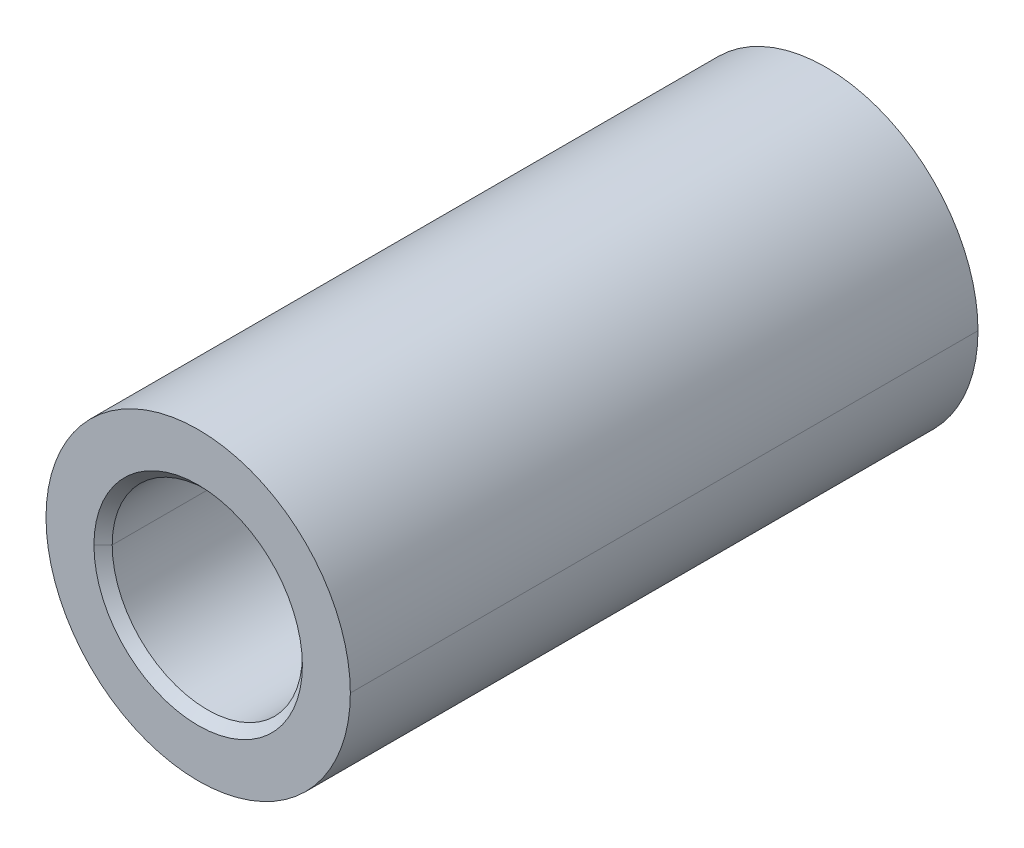
ISO-10303-21;
HEADER;
FILE_DESCRIPTION(('STEP AP214'),'2;1');
FILE_NAME('part.step','',(''),(''),'','','');
FILE_SCHEMA(('AUTOMOTIVE_DESIGN { 1 0 10303 214 1 1 1 1 }'));
ENDSEC;
DATA;
#1=APPLICATION_CONTEXT('core data for automotive mechanical design processes');
#2=APPLICATION_PROTOCOL_DEFINITION('international standard','automotive_design',2000,#1);
#3=PRODUCT_CONTEXT('',#1,'mechanical');
#4=PRODUCT('Part','Part','',(#3));
#5=PRODUCT_RELATED_PRODUCT_CATEGORY('part','',(#4));
#6=PRODUCT_DEFINITION_FORMATION('','',#4);
#7=PRODUCT_DEFINITION_CONTEXT('part definition',#1,'design');
#8=PRODUCT_DEFINITION('design','',#6,#7);
#9=PRODUCT_DEFINITION_SHAPE('','',#8);
#10=(LENGTH_UNIT() NAMED_UNIT(*) SI_UNIT(.MILLI.,.METRE.));
#11=(NAMED_UNIT(*) PLANE_ANGLE_UNIT() SI_UNIT($,.RADIAN.));
#12=(NAMED_UNIT(*) SI_UNIT($,.STERADIAN.) SOLID_ANGLE_UNIT());
#13=UNCERTAINTY_MEASURE_WITH_UNIT(LENGTH_MEASURE(1.E-05),#10,'distance_accuracy_value','');
#14=(GEOMETRIC_REPRESENTATION_CONTEXT(3) GLOBAL_UNCERTAINTY_ASSIGNED_CONTEXT((#13)) GLOBAL_UNIT_ASSIGNED_CONTEXT((#10,
#11,#12)) REPRESENTATION_CONTEXT('',''));
#15=CARTESIAN_POINT('',(0.,0.,0.));
#16=DIRECTION('',(0.,0.,1.));
#17=DIRECTION('',(1.,0.,0.));
#18=AXIS2_PLACEMENT_3D('',#15,#16,#17);
#19=CARTESIAN_POINT('',(0.,6.35,13.09624));
#20=DIRECTION('',(0.,0.,1.));
#21=DIRECTION('',(1.,0.,0.));
#22=AXIS2_PLACEMENT_3D('',#19,#20,#21);
#23=PLANE('',#22);
#24=CARTESIAN_POINT('',(0.,0.,13.09624));
#25=DIRECTION('',(0.,0.,-1.));
#26=DIRECTION('',(-1.,0.,0.));
#27=AXIS2_PLACEMENT_3D('',#24,#25,#26);
#28=CIRCLE('',#27,4.34975);
#29=CARTESIAN_POINT('',(-4.34975,0.,13.09624));
#30=VERTEX_POINT('',#29);
#31=CARTESIAN_POINT('',(4.34975,0.,13.09624));
#32=VERTEX_POINT('',#31);
#33=EDGE_CURVE('E11',#30,#32,#28,.T.);
#34=ORIENTED_EDGE('',*,*,#33,.T.);
#35=CARTESIAN_POINT('',(0.,0.,13.09624));
#36=DIRECTION('',(0.,0.,-1.));
#37=DIRECTION('',(-1.,0.,0.));
#38=AXIS2_PLACEMENT_3D('',#35,#36,#37);
#39=CIRCLE('',#38,4.34975);
#40=EDGE_CURVE('E25',#32,#30,#39,.T.);
#41=ORIENTED_EDGE('',*,*,#40,.T.);
#42=EDGE_LOOP('',(#34,#41));
#43=FACE_BOUND('',#42,.T.);
#44=CARTESIAN_POINT('',(0.,0.,13.09624));
#45=DIRECTION('',(0.,0.,-1.));
#46=DIRECTION('',(-1.,0.,0.));
#47=AXIS2_PLACEMENT_3D('',#44,#45,#46);
#48=CIRCLE('',#47,6.35);
#49=CARTESIAN_POINT('',(-6.35,0.,13.09624));
#50=VERTEX_POINT('',#49);
#51=CARTESIAN_POINT('',(6.35,0.,13.09624));
#52=VERTEX_POINT('',#51);
#53=EDGE_CURVE('E157',#50,#52,#48,.T.);
#54=ORIENTED_EDGE('',*,*,#53,.F.);
#55=CARTESIAN_POINT('',(0.,0.,13.09624));
#56=DIRECTION('',(0.,0.,-1.));
#57=DIRECTION('',(-1.,0.,0.));
#58=AXIS2_PLACEMENT_3D('',#55,#56,#57);
#59=CIRCLE('',#58,6.35);
#60=EDGE_CURVE('E152',#52,#50,#59,.T.);
#61=ORIENTED_EDGE('',*,*,#60,.F.);
#62=EDGE_LOOP('',(#54,#61));
#63=FACE_BOUND('',#62,.T.);
#64=ADVANCED_FACE('F17',(#43,#63),#23,.T.);
#65=CARTESIAN_POINT('',(0.,0.,-13.09624));
#66=DIRECTION('',(0.,0.,1.));
#67=DIRECTION('',(0.,1.,0.));
#68=AXIS2_PLACEMENT_3D('',#65,#66,#67);
#69=CYLINDRICAL_SURFACE('',#68,6.35);
#70=ORIENTED_EDGE('',*,*,#60,.T.);
#71=DIRECTION('',(0.,0.,1.));
#72=VECTOR('',#71,1.);
#73=CARTESIAN_POINT('',(-6.35,0.,-13.09624));
#74=LINE('',#73,#72);
#75=CARTESIAN_POINT('',(-6.35,0.,-13.09624));
#76=VERTEX_POINT('',#75);
#77=EDGE_CURVE('E147',#76,#50,#74,.T.);
#78=ORIENTED_EDGE('',*,*,#77,.F.);
#79=CARTESIAN_POINT('',(0.,0.,-13.09624));
#80=DIRECTION('',(0.,0.,-1.));
#81=DIRECTION('',(-1.,0.,0.));
#82=AXIS2_PLACEMENT_3D('',#79,#80,#81);
#83=CIRCLE('',#82,6.35);
#84=CARTESIAN_POINT('',(6.35,0.,-13.09624));
#85=VERTEX_POINT('',#84);
#86=EDGE_CURVE('E142',#85,#76,#83,.T.);
#87=ORIENTED_EDGE('',*,*,#86,.F.);
#88=DIRECTION('',(0.,0.,1.));
#89=VECTOR('',#88,1.);
#90=CARTESIAN_POINT('',(6.35,0.,-13.09624));
#91=LINE('',#90,#89);
#92=EDGE_CURVE('E137',#85,#52,#91,.T.);
#93=ORIENTED_EDGE('',*,*,#92,.T.);
#94=EDGE_LOOP('',(#70,#78,#87,#93));
#95=FACE_BOUND('',#94,.T.);
#96=ADVANCED_FACE('F172',(#95),#69,.T.);
#97=CARTESIAN_POINT('',(0.,0.,-13.09624));
#98=DIRECTION('',(0.,0.,1.));
#99=DIRECTION('',(0.,-1.,0.));
#100=AXIS2_PLACEMENT_3D('',#97,#98,#99);
#101=CYLINDRICAL_SURFACE('',#100,6.35);
#102=CARTESIAN_POINT('',(0.,0.,-13.09624));
#103=DIRECTION('',(0.,0.,-1.));
#104=DIRECTION('',(-1.,0.,0.));
#105=AXIS2_PLACEMENT_3D('',#102,#103,#104);
#106=CIRCLE('',#105,6.35);
#107=EDGE_CURVE('E132',#76,#85,#106,.T.);
#108=ORIENTED_EDGE('',*,*,#107,.F.);
#109=ORIENTED_EDGE('',*,*,#77,.T.);
#110=ORIENTED_EDGE('',*,*,#53,.T.);
#111=ORIENTED_EDGE('',*,*,#92,.F.);
#112=EDGE_LOOP('',(#108,#109,#110,#111));
#113=FACE_BOUND('',#112,.T.);
#114=ADVANCED_FACE('F169',(#113),#101,.T.);
#115=CARTESIAN_POINT('',(0.,4.34975,-13.09624));
#116=DIRECTION('',(0.,0.,-1.));
#117=DIRECTION('',(-1.,0.,0.));
#118=AXIS2_PLACEMENT_3D('',#115,#116,#117);
#119=PLANE('',#118);
#120=ORIENTED_EDGE('',*,*,#107,.T.);
#121=ORIENTED_EDGE('',*,*,#86,.T.);
#122=EDGE_LOOP('',(#120,#121));
#123=FACE_BOUND('',#122,.T.);
#124=CARTESIAN_POINT('',(0.,0.,-13.09624));
#125=DIRECTION('',(0.,0.,-1.));
#126=DIRECTION('',(-1.,0.,0.));
#127=AXIS2_PLACEMENT_3D('',#124,#125,#126);
#128=CIRCLE('',#127,4.34975);
#129=CARTESIAN_POINT('',(-4.34975,0.,-13.09624));
#130=VERTEX_POINT('',#129);
#131=CARTESIAN_POINT('',(4.34975000000097,0.,-13.096239999999));
#132=VERTEX_POINT('',#131);
#133=EDGE_CURVE('E127',#130,#132,#128,.T.);
#134=ORIENTED_EDGE('',*,*,#133,.F.);
#135=CARTESIAN_POINT('',(0.,0.,-13.09624));
#136=DIRECTION('',(0.,0.,-1.));
#137=DIRECTION('',(-1.,0.,0.));
#138=AXIS2_PLACEMENT_3D('',#135,#136,#137);
#139=CIRCLE('',#138,4.34975);
#140=EDGE_CURVE('E122',#132,#130,#139,.T.);
#141=ORIENTED_EDGE('',*,*,#140,.F.);
#142=EDGE_LOOP('',(#134,#141));
#143=FACE_BOUND('',#142,.T.);
#144=ADVANCED_FACE('F174',(#123,#143),#119,.T.);
#145=CARTESIAN_POINT('',(0.,0.,-12.71524));
#146=DIRECTION('',(0.,0.,-1.));
#147=DIRECTION('',(0.,1.,0.));
#148=AXIS2_PLACEMENT_3D('',#145,#146,#147);
#149=CONICAL_SURFACE('',#148,3.96875,0.7853981634);
#150=CARTESIAN_POINT('',(0.,0.,-12.71524));
#151=DIRECTION('',(0.,0.,-1.));
#152=DIRECTION('',(-1.,0.,0.));
#153=AXIS2_PLACEMENT_3D('',#150,#151,#152);
#154=CIRCLE('',#153,3.96875);
#155=CARTESIAN_POINT('',(3.96875,0.,-12.71524));
#156=VERTEX_POINT('',#155);
#157=CARTESIAN_POINT('',(-3.96875,0.,-12.71524));
#158=VERTEX_POINT('',#157);
#159=EDGE_CURVE('E83',#156,#158,#154,.T.);
#160=ORIENTED_EDGE('',*,*,#159,.F.);
#161=DIRECTION('',(0.707106781188353,0.,-0.707106781184743));
#162=VECTOR('',#161,1.);
#163=CARTESIAN_POINT('',(3.96875,0.,-12.71524));
#164=LINE('',#163,#162);
#165=EDGE_CURVE('E114',#156,#132,#164,.T.);
#166=ORIENTED_EDGE('',*,*,#165,.T.);
#167=ORIENTED_EDGE('',*,*,#140,.T.);
#168=DIRECTION('',(-0.707106781188353,0.,-0.707106781184743));
#169=VECTOR('',#168,1.);
#170=CARTESIAN_POINT('',(-3.96875,0.,-12.71524));
#171=LINE('',#170,#169);
#172=EDGE_CURVE('E109',#158,#130,#171,.T.);
#173=ORIENTED_EDGE('',*,*,#172,.F.);
#174=EDGE_LOOP('',(#160,#166,#167,#173));
#175=FACE_BOUND('',#174,.T.);
#176=ADVANCED_FACE('F177',(#175),#149,.F.);
#177=CARTESIAN_POINT('',(0.,0.,-12.71524));
#178=DIRECTION('',(0.,0.,-1.));
#179=DIRECTION('',(0.,-1.,0.));
#180=AXIS2_PLACEMENT_3D('',#177,#178,#179);
#181=CONICAL_SURFACE('',#180,3.96875,0.7853981634);
#182=ORIENTED_EDGE('',*,*,#133,.T.);
#183=ORIENTED_EDGE('',*,*,#165,.F.);
#184=CARTESIAN_POINT('',(0.,0.,-12.71524));
#185=DIRECTION('',(0.,0.,-1.));
#186=DIRECTION('',(-1.,0.,0.));
#187=AXIS2_PLACEMENT_3D('',#184,#185,#186);
#188=CIRCLE('',#187,3.96875);
#189=EDGE_CURVE('E105',#158,#156,#188,.T.);
#190=ORIENTED_EDGE('',*,*,#189,.F.);
#191=ORIENTED_EDGE('',*,*,#172,.T.);
#192=EDGE_LOOP('',(#182,#183,#190,#191));
#193=FACE_BOUND('',#192,.T.);
#194=ADVANCED_FACE('F183',(#193),#181,.F.);
#195=CARTESIAN_POINT('',(0.,0.,-13.09624));
#196=DIRECTION('',(0.,0.,1.));
#197=DIRECTION('',(0.,-1.,0.));
#198=AXIS2_PLACEMENT_3D('',#195,#196,#197);
#199=CYLINDRICAL_SURFACE('',#198,3.96875);
#200=ORIENTED_EDGE('',*,*,#189,.T.);
#201=DIRECTION('',(0.,0.,1.));
#202=VECTOR('',#201,1.);
#203=CARTESIAN_POINT('',(3.96875,0.,-12.71524));
#204=LINE('',#203,#202);
#205=CARTESIAN_POINT('',(3.96874999999903,0.,12.715240000001));
#206=VERTEX_POINT('',#205);
#207=EDGE_CURVE('E72',#156,#206,#204,.T.);
#208=ORIENTED_EDGE('',*,*,#207,.T.);
#209=CARTESIAN_POINT('',(0.,0.,12.71524));
#210=DIRECTION('',(0.,0.,-1.));
#211=DIRECTION('',(-1.,0.,0.));
#212=AXIS2_PLACEMENT_3D('',#209,#210,#211);
#213=CIRCLE('',#212,3.96875);
#214=CARTESIAN_POINT('',(-3.96875,0.,12.71524));
#215=VERTEX_POINT('',#214);
#216=EDGE_CURVE('E65',#215,#206,#213,.T.);
#217=ORIENTED_EDGE('',*,*,#216,.F.);
#218=DIRECTION('',(0.,0.,1.));
#219=VECTOR('',#218,1.);
#220=CARTESIAN_POINT('',(-3.96875,0.,-12.71524));
#221=LINE('',#220,#219);
#222=EDGE_CURVE('E69',#158,#215,#221,.T.);
#223=ORIENTED_EDGE('',*,*,#222,.F.);
#224=EDGE_LOOP('',(#200,#208,#217,#223));
#225=FACE_BOUND('',#224,.T.);
#226=ADVANCED_FACE('F68',(#225),#199,.F.);
#227=CARTESIAN_POINT('',(0.,0.,-13.09624));
#228=DIRECTION('',(0.,0.,1.));
#229=DIRECTION('',(0.,1.,0.));
#230=AXIS2_PLACEMENT_3D('',#227,#228,#229);
#231=CYLINDRICAL_SURFACE('',#230,3.96875);
#232=CARTESIAN_POINT('',(0.,0.,12.71524));
#233=DIRECTION('',(0.,0.,-1.));
#234=DIRECTION('',(-1.,0.,0.));
#235=AXIS2_PLACEMENT_3D('',#232,#233,#234);
#236=CIRCLE('',#235,3.96875);
#237=EDGE_CURVE('E81',#206,#215,#236,.T.);
#238=ORIENTED_EDGE('',*,*,#237,.F.);
#239=ORIENTED_EDGE('',*,*,#207,.F.);
#240=ORIENTED_EDGE('',*,*,#159,.T.);
#241=ORIENTED_EDGE('',*,*,#222,.T.);
#242=EDGE_LOOP('',(#238,#239,#240,#241));
#243=FACE_BOUND('',#242,.T.);
#244=ADVANCED_FACE('F80',(#243),#231,.F.);
#245=CARTESIAN_POINT('',(0.,0.,13.09624));
#246=DIRECTION('',(0.,0.,1.));
#247=DIRECTION('',(0.,1.,0.));
#248=AXIS2_PLACEMENT_3D('',#245,#246,#247);
#249=CONICAL_SURFACE('',#248,4.34975,0.7853981634);
#250=ORIENTED_EDGE('',*,*,#40,.F.);
#251=DIRECTION('',(0.707106781188352,0.,0.707106781184743));
#252=VECTOR('',#251,1.);
#253=CARTESIAN_POINT('',(3.96874999999903,0.,12.715240000001));
#254=LINE('',#253,#252);
#255=EDGE_CURVE('E88',#206,#32,#254,.T.);
#256=ORIENTED_EDGE('',*,*,#255,.F.);
#257=ORIENTED_EDGE('',*,*,#237,.T.);
#258=DIRECTION('',(-0.707106781188352,0.,0.707106781184743));
#259=VECTOR('',#258,1.);
#260=CARTESIAN_POINT('',(-3.96874999999903,0.,12.715240000001));
#261=LINE('',#260,#259);
#262=EDGE_CURVE('E87',#215,#30,#261,.T.);
#263=ORIENTED_EDGE('',*,*,#262,.T.);
#264=EDGE_LOOP('',(#250,#256,#257,#263));
#265=FACE_BOUND('',#264,.T.);
#266=ADVANCED_FACE('F86',(#265),#249,.F.);
#267=CARTESIAN_POINT('',(0.,0.,13.09624));
#268=DIRECTION('',(0.,0.,1.));
#269=DIRECTION('',(0.,-1.,0.));
#270=AXIS2_PLACEMENT_3D('',#267,#268,#269);
#271=CONICAL_SURFACE('',#270,4.34975,0.7853981634);
#272=ORIENTED_EDGE('',*,*,#216,.T.);
#273=ORIENTED_EDGE('',*,*,#255,.T.);
#274=ORIENTED_EDGE('',*,*,#33,.F.);
#275=ORIENTED_EDGE('',*,*,#262,.F.);
#276=EDGE_LOOP('',(#272,#273,#274,#275));
#277=FACE_BOUND('',#276,.T.);
#278=ADVANCED_FACE('F90',(#277),#271,.F.);
#279=CLOSED_SHELL('',(#64,#96,#114,#144,#176,#194,#226,#244,#266,#278));
#280=MANIFOLD_SOLID_BREP('B1',#279);
#281=ADVANCED_BREP_SHAPE_REPRESENTATION('',(#18,#280),#14);
#282=SHAPE_DEFINITION_REPRESENTATION(#9,#281);
ENDSEC;
END-ISO-10303-21;
